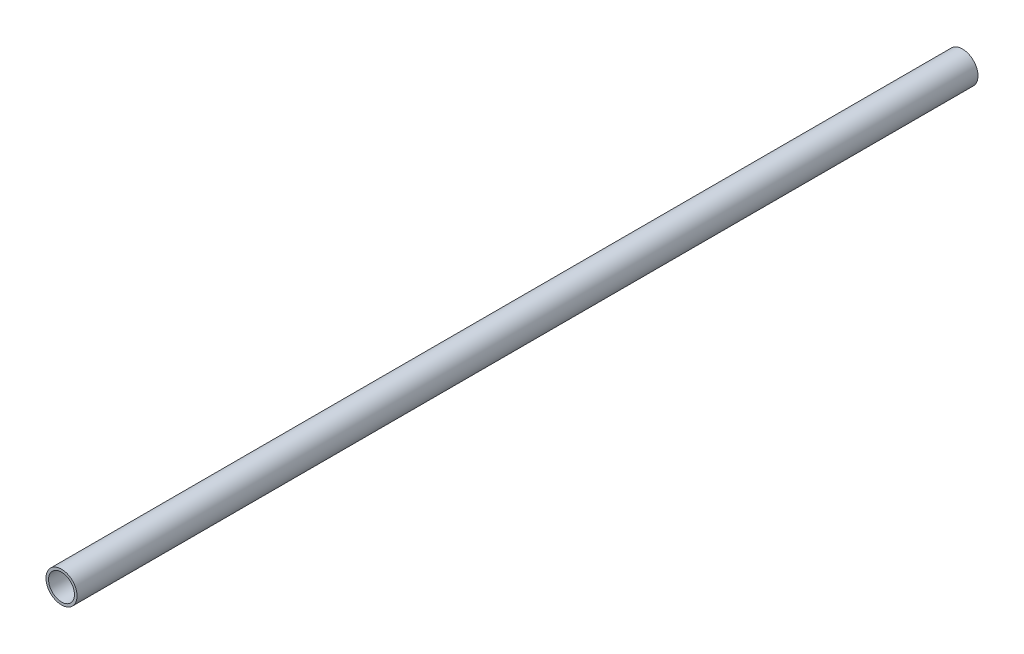
ISO-10303-21;
HEADER;
FILE_DESCRIPTION(('STEP AP214'),'2;1');
FILE_NAME('part.step','',(''),(''),'','','');
FILE_SCHEMA(('AUTOMOTIVE_DESIGN { 1 0 10303 214 1 1 1 1 }'));
ENDSEC;
DATA;
#1=APPLICATION_CONTEXT('core data for automotive mechanical design processes');
#2=APPLICATION_PROTOCOL_DEFINITION('international standard','automotive_design',2000,#1);
#3=PRODUCT_CONTEXT('',#1,'mechanical');
#4=PRODUCT('Part','Part','',(#3));
#5=PRODUCT_RELATED_PRODUCT_CATEGORY('part','',(#4));
#6=PRODUCT_DEFINITION_FORMATION('','',#4);
#7=PRODUCT_DEFINITION_CONTEXT('part definition',#1,'design');
#8=PRODUCT_DEFINITION('design','',#6,#7);
#9=PRODUCT_DEFINITION_SHAPE('','',#8);
#10=(LENGTH_UNIT() NAMED_UNIT(*) SI_UNIT(.MILLI.,.METRE.));
#11=(NAMED_UNIT(*) PLANE_ANGLE_UNIT() SI_UNIT($,.RADIAN.));
#12=(NAMED_UNIT(*) SI_UNIT($,.STERADIAN.) SOLID_ANGLE_UNIT());
#13=UNCERTAINTY_MEASURE_WITH_UNIT(LENGTH_MEASURE(1.E-05),#10,'distance_accuracy_value','');
#14=(GEOMETRIC_REPRESENTATION_CONTEXT(3) GLOBAL_UNCERTAINTY_ASSIGNED_CONTEXT((#13)) GLOBAL_UNIT_ASSIGNED_CONTEXT((#10,
#11,#12)) REPRESENTATION_CONTEXT('',''));
#15=CARTESIAN_POINT('',(0.,0.,0.));
#16=DIRECTION('',(0.,0.,1.));
#17=DIRECTION('',(1.,0.,0.));
#18=AXIS2_PLACEMENT_3D('',#15,#16,#17);
#19=CARTESIAN_POINT('',(0.,0.,347.94));
#20=DIRECTION('',(0.,0.,1.));
#21=DIRECTION('',(1.,0.,0.));
#22=AXIS2_PLACEMENT_3D('',#19,#20,#21);
#23=PLANE('',#22);
#24=CARTESIAN_POINT('',(0.,0.,347.94));
#25=DIRECTION('',(0.,0.,1.));
#26=DIRECTION('',(1.,0.,0.));
#27=AXIS2_PLACEMENT_3D('',#24,#25,#26);
#28=CIRCLE('',#27,6.);
#29=CARTESIAN_POINT('',(6.,0.,347.94));
#30=VERTEX_POINT('',#29);
#31=EDGE_CURVE('E10',#30,#30,#28,.T.);
#32=ORIENTED_EDGE('',*,*,#31,.T.);
#33=EDGE_LOOP('',(#32));
#34=FACE_BOUND('',#33,.T.);
#35=CARTESIAN_POINT('',(0.,0.,347.94));
#36=DIRECTION('',(0.,0.,1.));
#37=DIRECTION('',(1.,0.,0.));
#38=AXIS2_PLACEMENT_3D('',#35,#36,#37);
#39=CIRCLE('',#38,5.);
#40=CARTESIAN_POINT('',(5.,0.,347.94));
#41=VERTEX_POINT('',#40);
#42=EDGE_CURVE('E44',#41,#41,#39,.T.);
#43=ORIENTED_EDGE('',*,*,#42,.F.);
#44=EDGE_LOOP('',(#43));
#45=FACE_BOUND('',#44,.T.);
#46=ADVANCED_FACE('F33',(#34,#45),#23,.T.);
#47=CARTESIAN_POINT('',(0.,0.,0.));
#48=DIRECTION('',(0.,0.,1.));
#49=DIRECTION('',(1.,0.,0.));
#50=AXIS2_PLACEMENT_3D('',#47,#48,#49);
#51=PLANE('',#50);
#52=CARTESIAN_POINT('',(0.,0.,0.));
#53=DIRECTION('',(0.,0.,1.));
#54=DIRECTION('',(1.,0.,0.));
#55=AXIS2_PLACEMENT_3D('',#52,#53,#54);
#56=CIRCLE('',#55,6.);
#57=CARTESIAN_POINT('',(6.,0.,0.));
#58=VERTEX_POINT('',#57);
#59=EDGE_CURVE('E37',#58,#58,#56,.T.);
#60=ORIENTED_EDGE('',*,*,#59,.F.);
#61=EDGE_LOOP('',(#60));
#62=FACE_BOUND('',#61,.T.);
#63=CARTESIAN_POINT('',(0.,0.,0.));
#64=DIRECTION('',(0.,0.,1.));
#65=DIRECTION('',(1.,0.,0.));
#66=AXIS2_PLACEMENT_3D('',#63,#64,#65);
#67=CIRCLE('',#66,5.);
#68=CARTESIAN_POINT('',(5.,0.,0.));
#69=VERTEX_POINT('',#68);
#70=EDGE_CURVE('E46',#69,#69,#67,.T.);
#71=ORIENTED_EDGE('',*,*,#70,.T.);
#72=EDGE_LOOP('',(#71));
#73=FACE_BOUND('',#72,.T.);
#74=ADVANCED_FACE('F56',(#62,#73),#51,.F.);
#75=CARTESIAN_POINT('',(0.,0.,347.94));
#76=DIRECTION('',(0.,0.,-1.));
#77=DIRECTION('',(-1.,0.,0.));
#78=AXIS2_PLACEMENT_3D('',#75,#76,#77);
#79=CYLINDRICAL_SURFACE('',#78,6.);
#80=ORIENTED_EDGE('',*,*,#31,.F.);
#81=EDGE_LOOP('',(#80));
#82=FACE_BOUND('',#81,.T.);
#83=ORIENTED_EDGE('',*,*,#59,.T.);
#84=EDGE_LOOP('',(#83));
#85=FACE_BOUND('',#84,.T.);
#86=ADVANCED_FACE('F35',(#82,#85),#79,.T.);
#87=CARTESIAN_POINT('',(0.,0.,347.94));
#88=DIRECTION('',(0.,0.,-1.));
#89=DIRECTION('',(-1.,0.,0.));
#90=AXIS2_PLACEMENT_3D('',#87,#88,#89);
#91=CYLINDRICAL_SURFACE('',#90,5.);
#92=ORIENTED_EDGE('',*,*,#42,.T.);
#93=EDGE_LOOP('',(#92));
#94=FACE_BOUND('',#93,.T.);
#95=ORIENTED_EDGE('',*,*,#70,.F.);
#96=EDGE_LOOP('',(#95));
#97=FACE_BOUND('',#96,.T.);
#98=ADVANCED_FACE('F52',(#94,#97),#91,.F.);
#99=CLOSED_SHELL('',(#46,#74,#86,#98));
#100=MANIFOLD_SOLID_BREP('B2',#99);
#101=ADVANCED_BREP_SHAPE_REPRESENTATION('',(#18,#100),#14);
#102=SHAPE_DEFINITION_REPRESENTATION(#9,#101);
ENDSEC;
END-ISO-10303-21;
